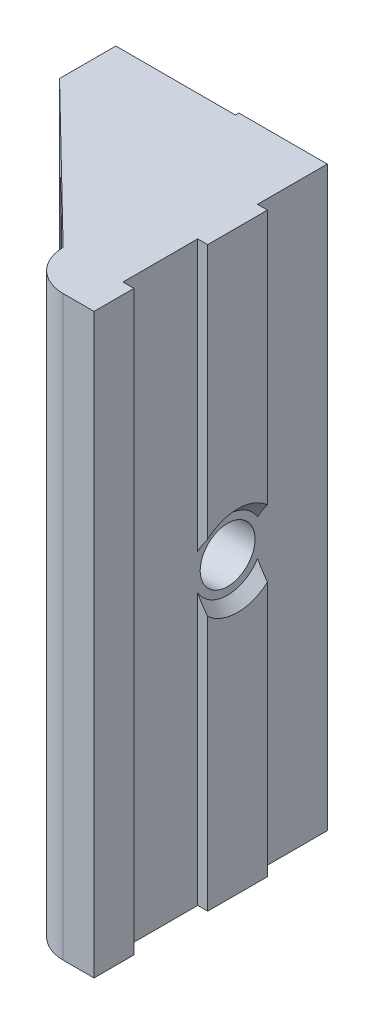
ISO-10303-21;
HEADER;
FILE_DESCRIPTION(('STEP AP214'),'2;1');
FILE_NAME('part.step','',(''),(''),'','','');
FILE_SCHEMA(('AUTOMOTIVE_DESIGN { 1 0 10303 214 1 1 1 1 }'));
ENDSEC;
DATA;
#1=APPLICATION_CONTEXT('core data for automotive mechanical design processes');
#2=APPLICATION_PROTOCOL_DEFINITION('international standard','automotive_design',2000,#1);
#3=PRODUCT_CONTEXT('',#1,'mechanical');
#4=PRODUCT('Part','Part','',(#3));
#5=PRODUCT_RELATED_PRODUCT_CATEGORY('part','',(#4));
#6=PRODUCT_DEFINITION_FORMATION('','',#4);
#7=PRODUCT_DEFINITION_CONTEXT('part definition',#1,'design');
#8=PRODUCT_DEFINITION('design','',#6,#7);
#9=PRODUCT_DEFINITION_SHAPE('','',#8);
#10=(LENGTH_UNIT() NAMED_UNIT(*) SI_UNIT(.MILLI.,.METRE.));
#11=(NAMED_UNIT(*) PLANE_ANGLE_UNIT() SI_UNIT($,.RADIAN.));
#12=(NAMED_UNIT(*) SI_UNIT($,.STERADIAN.) SOLID_ANGLE_UNIT());
#13=UNCERTAINTY_MEASURE_WITH_UNIT(LENGTH_MEASURE(1.E-05),#10,'distance_accuracy_value','');
#14=(GEOMETRIC_REPRESENTATION_CONTEXT(3) GLOBAL_UNCERTAINTY_ASSIGNED_CONTEXT((#13)) GLOBAL_UNIT_ASSIGNED_CONTEXT((#10,
#11,#12)) REPRESENTATION_CONTEXT('',''));
#15=CARTESIAN_POINT('',(0.,0.,0.));
#16=DIRECTION('',(0.,0.,1.));
#17=DIRECTION('',(1.,0.,0.));
#18=AXIS2_PLACEMENT_3D('',#15,#16,#17);
#19=CARTESIAN_POINT('',(-9.,0.,0.));
#20=DIRECTION('',(1.,0.,0.));
#21=DIRECTION('',(0.,0.,-1.));
#22=AXIS2_PLACEMENT_3D('',#19,#20,#21);
#23=PLANE('',#22);
#24=DIRECTION('',(0.,-1.,0.));
#25=VECTOR('',#24,1.);
#26=CARTESIAN_POINT('',(-9.,-28.956,13.));
#27=LINE('',#26,#25);
#28=CARTESIAN_POINT('',(-9.,28.956,13.));
#29=VERTEX_POINT('',#28);
#30=CARTESIAN_POINT('',(-9.,3.35410196624969,13.));
#31=VERTEX_POINT('',#30);
#32=EDGE_CURVE('E555',#29,#31,#27,.T.);
#33=ORIENTED_EDGE('',*,*,#32,.T.);
#34=CARTESIAN_POINT('',(-9.,0.,10.));
#35=DIRECTION('',(1.,0.,0.));
#36=DIRECTION('',(0.,0.,-1.));
#37=AXIS2_PLACEMENT_3D('',#34,#35,#36);
#38=CIRCLE('',#37,4.5);
#39=CARTESIAN_POINT('',(-9.,3.35410196624969,6.99999999999999));
#40=VERTEX_POINT('',#39);
#41=EDGE_CURVE('E524',#31,#40,#38,.F.);
#42=ORIENTED_EDGE('',*,*,#41,.T.);
#43=DIRECTION('',(0.,1.,0.));
#44=VECTOR('',#43,1.);
#45=CARTESIAN_POINT('',(-9.,-28.956,6.99999999999999));
#46=LINE('',#45,#44);
#47=CARTESIAN_POINT('',(-9.,28.956,7.));
#48=VERTEX_POINT('',#47);
#49=EDGE_CURVE('E297',#40,#48,#46,.T.);
#50=ORIENTED_EDGE('',*,*,#49,.T.);
#51=DIRECTION('',(0.,0.,1.));
#52=VECTOR('',#51,1.);
#53=CARTESIAN_POINT('',(-9.,28.956,7.));
#54=LINE('',#53,#52);
#55=EDGE_CURVE('E550',#48,#29,#54,.T.);
#56=ORIENTED_EDGE('',*,*,#55,.T.);
#57=EDGE_LOOP('',(#33,#42,#50,#56));
#58=FACE_BOUND('',#57,.T.);
#59=ADVANCED_FACE('F126',(#58),#23,.T.);
#60=CARTESIAN_POINT('',(-9.,-28.956,6.99999999999999));
#61=DIRECTION('',(0.,0.,1.));
#62=DIRECTION('',(0.,-1.,0.));
#63=AXIS2_PLACEMENT_3D('',#60,#61,#62);
#64=PLANE('',#63);
#65=DIRECTION('',(0.,1.,0.));
#66=VECTOR('',#65,1.);
#67=CARTESIAN_POINT('',(-10.,-28.956,6.99999999999999));
#68=LINE('',#67,#66);
#69=CARTESIAN_POINT('',(-10.,-28.956,6.99999999999999));
#70=VERTEX_POINT('',#69);
#71=CARTESIAN_POINT('',(-10.,-1.80277563773198,6.99999999999999));
#72=VERTEX_POINT('',#71);
#73=EDGE_CURVE('E278',#70,#72,#68,.T.);
#74=ORIENTED_EDGE('',*,*,#73,.T.);
#75=CARTESIAN_POINT('',(-10.,-1.80277563773198,6.99999999999999));
#76=CARTESIAN_POINT('',(-9.964690317231,-1.87131223911758,6.99999999999999));
#77=CARTESIAN_POINT('',(-9.92823062109702,-1.93924247382411,6.99999999999999));
#78=CARTESIAN_POINT('',(-9.85332433537536,-2.0739792796784,6.99999999999999));
#79=CARTESIAN_POINT('',(-9.81487821748002,-2.14078611263845,6.99999999999999));
#80=CARTESIAN_POINT('',(-9.69713113287627,-2.33948821505611,6.99999999999999));
#81=CARTESIAN_POINT('',(-9.61530500874234,-2.4698865397008,6.99999999999999));
#82=CARTESIAN_POINT('',(-9.44674811468295,-2.72732431182234,6.99999999999999));
#83=CARTESIAN_POINT('',(-9.36002040959327,-2.8543657868885,6.99999999999999));
#84=CARTESIAN_POINT('',(-9.22704876794235,-3.04304091049056,6.99999999999999));
#85=CARTESIAN_POINT('',(-9.18220635469892,-3.10566943304079,6.99999999999999));
#86=CARTESIAN_POINT('',(-9.0916956242936,-3.23032193951046,6.99999999999999));
#87=CARTESIAN_POINT('',(-9.0460273523368,-3.29234595623449,6.99999999999999));
#88=CARTESIAN_POINT('',(-9.,-3.35410196624968,6.99999999999999));
#89=B_SPLINE_CURVE_WITH_KNOTS('',3,(#75,#76,#77,#78,#79,#80,#81,#82,#83,#84,#85,#86,#87,#88),
.UNSPECIFIED.,.F.,.F.,(4,2,2,2,2,2,4),(0.,0.231263004816279,0.462471344460014,0.924138463174956,
1.38552003981709,1.61659573618336,1.84765882219885),.UNSPECIFIED.);
#90=CARTESIAN_POINT('',(-9.,-3.35410196624968,6.99999999999999));
#91=VERTEX_POINT('',#90);
#92=EDGE_CURVE('E155',#72,#91,#89,.T.);
#93=ORIENTED_EDGE('',*,*,#92,.T.);
#94=CARTESIAN_POINT('',(-9.,-28.956,6.99999999999999));
#95=VERTEX_POINT('',#94);
#96=EDGE_CURVE('E553',#95,#91,#46,.T.);
#97=ORIENTED_EDGE('',*,*,#96,.F.);
#98=DIRECTION('',(-1.,0.,0.));
#99=VECTOR('',#98,1.);
#100=CARTESIAN_POINT('',(-9.,-28.956,6.99999999999999));
#101=LINE('',#100,#99);
#102=EDGE_CURVE('E287',#95,#70,#101,.T.);
#103=ORIENTED_EDGE('',*,*,#102,.T.);
#104=EDGE_LOOP('',(#74,#93,#97,#103));
#105=FACE_BOUND('',#104,.T.);
#106=ADVANCED_FACE('F285',(#105),#64,.F.);
#107=CARTESIAN_POINT('',(-9.,-28.956,13.));
#108=DIRECTION('',(0.,0.,-1.));
#109=DIRECTION('',(0.,1.,0.));
#110=AXIS2_PLACEMENT_3D('',#107,#108,#109);
#111=PLANE('',#110);
#112=DIRECTION('',(0.,-1.,0.));
#113=VECTOR('',#112,1.);
#114=CARTESIAN_POINT('',(-10.,-28.956,13.));
#115=LINE('',#114,#113);
#116=CARTESIAN_POINT('',(-10.,28.956,13.));
#117=VERTEX_POINT('',#116);
#118=CARTESIAN_POINT('',(-10.,1.802775637732,13.));
#119=VERTEX_POINT('',#118);
#120=EDGE_CURVE('E290',#117,#119,#115,.T.);
#121=ORIENTED_EDGE('',*,*,#120,.T.);
#122=CARTESIAN_POINT('',(-10.,1.802775637732,13.));
#123=CARTESIAN_POINT('',(-9.964690317231,1.8713122391176,13.));
#124=CARTESIAN_POINT('',(-9.92823062109702,1.93924247382413,13.));
#125=CARTESIAN_POINT('',(-9.85332433537536,2.07397927967842,13.));
#126=CARTESIAN_POINT('',(-9.81487821748002,2.14078611263847,13.));
#127=CARTESIAN_POINT('',(-9.69713113287627,2.33948821505612,13.));
#128=CARTESIAN_POINT('',(-9.61530500874234,2.46988653970081,13.));
#129=CARTESIAN_POINT('',(-9.44674811468295,2.72732431182236,13.));
#130=CARTESIAN_POINT('',(-9.36002040959327,2.85436578688851,13.));
#131=CARTESIAN_POINT('',(-9.22704876794235,3.04304091049058,13.));
#132=CARTESIAN_POINT('',(-9.18220635469892,3.1056694330408,13.));
#133=CARTESIAN_POINT('',(-9.0916956242936,3.23032193951047,13.));
#134=CARTESIAN_POINT('',(-9.04602735233679,3.2923459562345,13.));
#135=CARTESIAN_POINT('',(-9.,3.35410196624969,13.));
#136=B_SPLINE_CURVE_WITH_KNOTS('',3,(#122,#123,#124,#125,#126,#127,#128,#129,#130,#131,#132,
#133,#134,#135),.UNSPECIFIED.,.F.,.F.,(4,2,2,2,2,2,4),(0.,0.231263004816278,0.462471344460011,
0.924138463174952,1.38552003981708,1.61659573618336,1.84765882219885),.UNSPECIFIED.);
#137=EDGE_CURVE('E435',#119,#31,#136,.T.);
#138=ORIENTED_EDGE('',*,*,#137,.T.);
#139=ORIENTED_EDGE('',*,*,#32,.F.);
#140=DIRECTION('',(-1.,0.,0.));
#141=VECTOR('',#140,1.);
#142=CARTESIAN_POINT('',(-9.,28.956,13.));
#143=LINE('',#142,#141);
#144=EDGE_CURVE('E302',#29,#117,#143,.T.);
#145=ORIENTED_EDGE('',*,*,#144,.T.);
#146=EDGE_LOOP('',(#121,#138,#139,#145));
#147=FACE_BOUND('',#146,.T.);
#148=ADVANCED_FACE('F480',(#147),#111,.F.);
#149=CARTESIAN_POINT('',(-10.,0.,6.));
#150=DIRECTION('',(-1.,0.,0.));
#151=DIRECTION('',(0.,0.,1.));
#152=AXIS2_PLACEMENT_3D('',#149,#150,#151);
#153=PLANE('',#152);
#154=CARTESIAN_POINT('',(-10.,-1.802775637732,13.));
#155=VERTEX_POINT('',#154);
#156=CARTESIAN_POINT('',(-10.,-28.956,13.));
#157=VERTEX_POINT('',#156);
#158=EDGE_CURVE('E281',#155,#157,#115,.T.);
#159=ORIENTED_EDGE('',*,*,#158,.F.);
#160=CARTESIAN_POINT('',(-10.,0.,10.));
#161=DIRECTION('',(-1.,0.,0.));
#162=DIRECTION('',(0.,0.,1.));
#163=AXIS2_PLACEMENT_3D('',#160,#161,#162);
#164=CIRCLE('',#163,3.5);
#165=EDGE_CURVE('E270',#155,#72,#164,.F.);
#166=ORIENTED_EDGE('',*,*,#165,.T.);
#167=ORIENTED_EDGE('',*,*,#73,.F.);
#168=DIRECTION('',(0.,0.,-1.));
#169=VECTOR('',#168,1.);
#170=CARTESIAN_POINT('',(-10.,-28.956,6.));
#171=LINE('',#170,#169);
#172=CARTESIAN_POINT('',(-10.,-28.956,0.));
#173=VERTEX_POINT('',#172);
#174=EDGE_CURVE('E396',#70,#173,#171,.T.);
#175=ORIENTED_EDGE('',*,*,#174,.T.);
#176=DIRECTION('',(0.,1.,0.));
#177=VECTOR('',#176,1.);
#178=CARTESIAN_POINT('',(-10.,0.,0.));
#179=LINE('',#178,#177);
#180=CARTESIAN_POINT('',(-10.,28.956,0.));
#181=VERTEX_POINT('',#180);
#182=EDGE_CURVE('E381',#173,#181,#179,.T.);
#183=ORIENTED_EDGE('',*,*,#182,.T.);
#184=DIRECTION('',(0.,0.,-1.));
#185=VECTOR('',#184,1.);
#186=CARTESIAN_POINT('',(-10.,28.956,6.));
#187=LINE('',#186,#185);
#188=CARTESIAN_POINT('',(-10.,28.956,7.));
#189=VERTEX_POINT('',#188);
#190=EDGE_CURVE('E392',#189,#181,#187,.T.);
#191=ORIENTED_EDGE('',*,*,#190,.F.);
#192=CARTESIAN_POINT('',(-10.,1.80277563773199,6.99999999999999));
#193=VERTEX_POINT('',#192);
#194=EDGE_CURVE('E288',#193,#189,#68,.T.);
#195=ORIENTED_EDGE('',*,*,#194,.F.);
#196=EDGE_CURVE('E283',#193,#119,#164,.F.);
#197=ORIENTED_EDGE('',*,*,#196,.T.);
#198=ORIENTED_EDGE('',*,*,#120,.F.);
#199=CARTESIAN_POINT('',(-10.,28.956,20.5));
#200=VERTEX_POINT('',#199);
#201=EDGE_CURVE('E393',#200,#117,#187,.T.);
#202=ORIENTED_EDGE('',*,*,#201,.F.);
#203=DIRECTION('',(0.,-1.,0.));
#204=VECTOR('',#203,1.);
#205=CARTESIAN_POINT('',(-10.,57.6707265527638,20.5));
#206=LINE('',#205,#204);
#207=CARTESIAN_POINT('',(-10.,-28.956,20.5));
#208=VERTEX_POINT('',#207);
#209=EDGE_CURVE('E365',#200,#208,#206,.T.);
#210=ORIENTED_EDGE('',*,*,#209,.T.);
#211=EDGE_CURVE('E397',#208,#157,#171,.T.);
#212=ORIENTED_EDGE('',*,*,#211,.T.);
#213=EDGE_LOOP('',(#159,#166,#167,#175,#183,#191,#195,#197,#198,#202,#210,#212));
#214=FACE_BOUND('',#213,.T.);
#215=CARTESIAN_POINT('',(-10.,0.,10.));
#216=DIRECTION('',(-1.,0.,0.));
#217=DIRECTION('',(0.,0.,1.));
#218=AXIS2_PLACEMENT_3D('',#215,#216,#217);
#219=CIRCLE('',#218,2.75);
#220=CARTESIAN_POINT('',(-10.,0.,12.75));
#221=VERTEX_POINT('',#220);
#222=EDGE_CURVE('E282',#221,#221,#219,.F.);
#223=ORIENTED_EDGE('',*,*,#222,.F.);
#224=EDGE_LOOP('',(#223));
#225=FACE_BOUND('',#224,.T.);
#226=ADVANCED_FACE('F276',(#214,#225),#153,.F.);
#227=CARTESIAN_POINT('',(0.,0.,0.));
#228=DIRECTION('',(0.,0.,1.));
#229=DIRECTION('',(1.,0.,0.));
#230=AXIS2_PLACEMENT_3D('',#227,#228,#229);
#231=PLANE('',#230);
#232=DIRECTION('',(-1.,0.,0.));
#233=VECTOR('',#232,1.);
#234=CARTESIAN_POINT('',(0.,-28.956,0.));
#235=LINE('',#234,#233);
#236=CARTESIAN_POINT('',(-18.861,-28.956,0.));
#237=VERTEX_POINT('',#236);
#238=EDGE_CURVE('E351',#173,#237,#235,.T.);
#239=ORIENTED_EDGE('',*,*,#238,.T.);
#240=DIRECTION('',(0.,1.,0.));
#241=VECTOR('',#240,1.);
#242=CARTESIAN_POINT('',(-18.861,-28.956,0.));
#243=LINE('',#242,#241);
#244=CARTESIAN_POINT('',(-18.861,28.956,0.));
#245=VERTEX_POINT('',#244);
#246=EDGE_CURVE('E320',#237,#245,#243,.T.);
#247=ORIENTED_EDGE('',*,*,#246,.T.);
#248=DIRECTION('',(-1.,0.,0.));
#249=VECTOR('',#248,1.);
#250=CARTESIAN_POINT('',(0.,28.956,0.));
#251=LINE('',#250,#249);
#252=EDGE_CURVE('E384',#181,#245,#251,.T.);
#253=ORIENTED_EDGE('',*,*,#252,.F.);
#254=ORIENTED_EDGE('',*,*,#182,.F.);
#255=EDGE_LOOP('',(#239,#247,#253,#254));
#256=FACE_BOUND('',#255,.T.);
#257=ADVANCED_FACE('F466',(#256),#231,.F.);
#258=CARTESIAN_POINT('',(0.,28.956,6.));
#259=DIRECTION('',(0.,-1.,0.));
#260=DIRECTION('',(1.,0.,0.));
#261=AXIS2_PLACEMENT_3D('',#258,#259,#260);
#262=PLANE('',#261);
#263=DIRECTION('',(0.71574671716627,0.,0.698359962244191));
#264=VECTOR('',#263,1.);
#265=CARTESIAN_POINT('',(-30.861,28.956,6.00000000000001));
#266=LINE('',#265,#264);
#267=CARTESIAN_POINT('',(-30.861,28.956,6.));
#268=VERTEX_POINT('',#267);
#269=CARTESIAN_POINT('',(-16.,28.956,20.5));
#270=VERTEX_POINT('',#269);
#271=EDGE_CURVE('E349',#268,#270,#266,.T.);
#272=ORIENTED_EDGE('',*,*,#271,.T.);
#273=CARTESIAN_POINT('',(-12.,28.956,20.5));
#274=DIRECTION('',(0.,-1.,0.));
#275=DIRECTION('',(1.,0.,0.));
#276=AXIS2_PLACEMENT_3D('',#273,#274,#275);
#277=CIRCLE('',#276,4.);
#278=CARTESIAN_POINT('',(-12.,28.956,24.5));
#279=VERTEX_POINT('',#278);
#280=EDGE_CURVE('E422',#270,#279,#277,.F.);
#281=ORIENTED_EDGE('',*,*,#280,.T.);
#282=DIRECTION('',(1.,0.,0.));
#283=VECTOR('',#282,1.);
#284=CARTESIAN_POINT('',(-16.,28.956,24.5));
#285=LINE('',#284,#283);
#286=CARTESIAN_POINT('',(-8.9,28.956,24.5));
#287=VERTEX_POINT('',#286);
#288=EDGE_CURVE('E347',#279,#287,#285,.T.);
#289=ORIENTED_EDGE('',*,*,#288,.T.);
#290=DIRECTION('',(0.,0.,-1.));
#291=VECTOR('',#290,1.);
#292=CARTESIAN_POINT('',(-8.9,28.956,20.5));
#293=LINE('',#292,#291);
#294=CARTESIAN_POINT('',(-8.9,28.956,20.5));
#295=VERTEX_POINT('',#294);
#296=EDGE_CURVE('E344',#287,#295,#293,.T.);
#297=ORIENTED_EDGE('',*,*,#296,.T.);
#298=DIRECTION('',(-1.,0.,0.));
#299=VECTOR('',#298,1.);
#300=CARTESIAN_POINT('',(-9.99999999999999,28.956,20.5));
#301=LINE('',#300,#299);
#302=EDGE_CURVE('E341',#295,#200,#301,.T.);
#303=ORIENTED_EDGE('',*,*,#302,.T.);
#304=ORIENTED_EDGE('',*,*,#201,.T.);
#305=ORIENTED_EDGE('',*,*,#144,.F.);
#306=ORIENTED_EDGE('',*,*,#55,.F.);
#307=DIRECTION('',(-1.,0.,0.));
#308=VECTOR('',#307,1.);
#309=CARTESIAN_POINT('',(-9.,28.956,7.));
#310=LINE('',#309,#308);
#311=EDGE_CURVE('E305',#48,#189,#310,.T.);
#312=ORIENTED_EDGE('',*,*,#311,.T.);
#313=ORIENTED_EDGE('',*,*,#190,.T.);
#314=ORIENTED_EDGE('',*,*,#252,.T.);
#315=DIRECTION('',(0.,0.,-1.));
#316=VECTOR('',#315,1.);
#317=CARTESIAN_POINT('',(-18.861,28.956,0.));
#318=LINE('',#317,#316);
#319=CARTESIAN_POINT('',(-18.861,28.956,0.35));
#320=VERTEX_POINT('',#319);
#321=EDGE_CURVE('E313',#320,#245,#318,.T.);
#322=ORIENTED_EDGE('',*,*,#321,.F.);
#323=DIRECTION('',(1.,0.,0.));
#324=VECTOR('',#323,1.);
#325=CARTESIAN_POINT('',(-30.861,28.956,0.35));
#326=LINE('',#325,#324);
#327=CARTESIAN_POINT('',(-30.861,28.956,0.35));
#328=VERTEX_POINT('',#327);
#329=EDGE_CURVE('E308',#328,#320,#326,.T.);
#330=ORIENTED_EDGE('',*,*,#329,.F.);
#331=DIRECTION('',(0.,0.,-1.));
#332=VECTOR('',#331,1.);
#333=CARTESIAN_POINT('',(-30.861,28.956,6.));
#334=LINE('',#333,#332);
#335=EDGE_CURVE('E389',#268,#328,#334,.T.);
#336=ORIENTED_EDGE('',*,*,#335,.F.);
#337=EDGE_LOOP('',(#272,#281,#289,#297,#303,#304,#305,#306,#312,#313,#314,#322,#330,#336));
#338=FACE_BOUND('',#337,.T.);
#339=ADVANCED_FACE('F469',(#338),#262,.F.);
#340=CARTESIAN_POINT('',(-30.861,0.,6.));
#341=DIRECTION('',(1.,0.,0.));
#342=DIRECTION('',(0.,0.,-1.));
#343=AXIS2_PLACEMENT_3D('',#340,#341,#342);
#344=PLANE('',#343);
#345=ORIENTED_EDGE('',*,*,#335,.T.);
#346=DIRECTION('',(0.,1.,0.));
#347=VECTOR('',#346,1.);
#348=CARTESIAN_POINT('',(-30.861,-28.956,0.35));
#349=LINE('',#348,#347);
#350=CARTESIAN_POINT('',(-30.861,-28.956,0.35));
#351=VERTEX_POINT('',#350);
#352=EDGE_CURVE('E316',#351,#328,#349,.T.);
#353=ORIENTED_EDGE('',*,*,#352,.F.);
#354=DIRECTION('',(0.,0.,-1.));
#355=VECTOR('',#354,1.);
#356=CARTESIAN_POINT('',(-30.861,-28.956,6.));
#357=LINE('',#356,#355);
#358=CARTESIAN_POINT('',(-30.861,-28.956,6.));
#359=VERTEX_POINT('',#358);
#360=EDGE_CURVE('E377',#359,#351,#357,.T.);
#361=ORIENTED_EDGE('',*,*,#360,.F.);
#362=DIRECTION('',(0.,-1.,0.));
#363=VECTOR('',#362,1.);
#364=CARTESIAN_POINT('',(-30.861,0.,6.));
#365=LINE('',#364,#363);
#366=CARTESIAN_POINT('',(-30.861,-3.40036762718386,6.));
#367=VERTEX_POINT('',#366);
#368=EDGE_CURVE('E378',#367,#359,#365,.T.);
#369=ORIENTED_EDGE('',*,*,#368,.F.);
#370=CARTESIAN_POINT('',(-30.861,0.,10.));
#371=DIRECTION('',(1.,0.,0.));
#372=DIRECTION('',(0.,0.,-1.));
#373=AXIS2_PLACEMENT_3D('',#370,#371,#372);
#374=CIRCLE('',#373,5.25);
#375=CARTESIAN_POINT('',(-30.861,3.40036762718386,6.));
#376=VERTEX_POINT('',#375);
#377=EDGE_CURVE('E330',#367,#376,#374,.T.);
#378=ORIENTED_EDGE('',*,*,#377,.T.);
#379=EDGE_CURVE('E374',#268,#376,#365,.T.);
#380=ORIENTED_EDGE('',*,*,#379,.F.);
#381=EDGE_LOOP('',(#345,#353,#361,#369,#378,#380));
#382=FACE_BOUND('',#381,.T.);
#383=ADVANCED_FACE('F471',(#382),#344,.F.);
#384=CARTESIAN_POINT('',(0.,-28.956,6.));
#385=DIRECTION('',(0.,-1.,0.));
#386=DIRECTION('',(0.,0.,-1.));
#387=AXIS2_PLACEMENT_3D('',#384,#385,#386);
#388=PLANE('',#387);
#389=DIRECTION('',(-1.,0.,0.));
#390=VECTOR('',#389,1.);
#391=CARTESIAN_POINT('',(-16.,-28.956,24.5));
#392=LINE('',#391,#390);
#393=CARTESIAN_POINT('',(-8.9,-28.956,24.5));
#394=VERTEX_POINT('',#393);
#395=CARTESIAN_POINT('',(-12.,-28.956,24.5));
#396=VERTEX_POINT('',#395);
#397=EDGE_CURVE('E359',#394,#396,#392,.T.);
#398=ORIENTED_EDGE('',*,*,#397,.T.);
#399=CARTESIAN_POINT('',(-12.,-28.956,20.5));
#400=DIRECTION('',(0.,-1.,0.));
#401=DIRECTION('',(0.,0.,-1.));
#402=AXIS2_PLACEMENT_3D('',#399,#400,#401);
#403=CIRCLE('',#402,4.);
#404=CARTESIAN_POINT('',(-16.,-28.956,20.5));
#405=VERTEX_POINT('',#404);
#406=EDGE_CURVE('E420',#396,#405,#403,.T.);
#407=ORIENTED_EDGE('',*,*,#406,.T.);
#408=DIRECTION('',(-0.71574671716627,0.,-0.698359962244191));
#409=VECTOR('',#408,1.);
#410=CARTESIAN_POINT('',(-30.861,-28.956,6.));
#411=LINE('',#410,#409);
#412=EDGE_CURVE('E362',#405,#359,#411,.T.);
#413=ORIENTED_EDGE('',*,*,#412,.T.);
#414=ORIENTED_EDGE('',*,*,#360,.T.);
#415=DIRECTION('',(1.,0.,0.));
#416=VECTOR('',#415,1.);
#417=CARTESIAN_POINT('',(-30.861,-28.956,0.35));
#418=LINE('',#417,#416);
#419=CARTESIAN_POINT('',(-18.861,-28.956,0.35));
#420=VERTEX_POINT('',#419);
#421=EDGE_CURVE('E309',#351,#420,#418,.T.);
#422=ORIENTED_EDGE('',*,*,#421,.T.);
#423=DIRECTION('',(0.,0.,-1.));
#424=VECTOR('',#423,1.);
#425=CARTESIAN_POINT('',(-18.861,-28.956,0.));
#426=LINE('',#425,#424);
#427=EDGE_CURVE('E312',#420,#237,#426,.T.);
#428=ORIENTED_EDGE('',*,*,#427,.T.);
#429=ORIENTED_EDGE('',*,*,#238,.F.);
#430=ORIENTED_EDGE('',*,*,#174,.F.);
#431=ORIENTED_EDGE('',*,*,#102,.F.);
#432=DIRECTION('',(0.,0.,-1.));
#433=VECTOR('',#432,1.);
#434=CARTESIAN_POINT('',(-9.,-28.956,6.99999999999999));
#435=LINE('',#434,#433);
#436=CARTESIAN_POINT('',(-9.,-28.956,13.));
#437=VERTEX_POINT('',#436);
#438=EDGE_CURVE('E293',#437,#95,#435,.T.);
#439=ORIENTED_EDGE('',*,*,#438,.F.);
#440=DIRECTION('',(-1.,0.,0.));
#441=VECTOR('',#440,1.);
#442=CARTESIAN_POINT('',(-9.,-28.956,13.));
#443=LINE('',#442,#441);
#444=EDGE_CURVE('E299',#437,#157,#443,.T.);
#445=ORIENTED_EDGE('',*,*,#444,.T.);
#446=ORIENTED_EDGE('',*,*,#211,.F.);
#447=DIRECTION('',(1.,0.,0.));
#448=VECTOR('',#447,1.);
#449=CARTESIAN_POINT('',(-10.,-28.956,20.5));
#450=LINE('',#449,#448);
#451=CARTESIAN_POINT('',(-8.9,-28.956,20.5));
#452=VERTEX_POINT('',#451);
#453=EDGE_CURVE('E352',#208,#452,#450,.T.);
#454=ORIENTED_EDGE('',*,*,#453,.T.);
#455=DIRECTION('',(0.,0.,1.));
#456=VECTOR('',#455,1.);
#457=CARTESIAN_POINT('',(-8.9,-28.956,20.5));
#458=LINE('',#457,#456);
#459=EDGE_CURVE('E355',#452,#394,#458,.T.);
#460=ORIENTED_EDGE('',*,*,#459,.T.);
#461=EDGE_LOOP('',(#398,#407,#413,#414,#422,#428,#429,#430,#431,#439,#445,#446,#454,#460));
#462=FACE_BOUND('',#461,.T.);
#463=ADVANCED_FACE('F451',(#462),#388,.T.);
#464=CARTESIAN_POINT('',(-30.861,57.6707265527638,6.));
#465=DIRECTION('',(-0.698359962244191,0.,0.71574671716627));
#466=DIRECTION('',(0.71574671716627,0.,0.698359962244191));
#467=AXIS2_PLACEMENT_3D('',#464,#465,#466);
#468=PLANE('',#467);
#469=CARTESIAN_POINT('',(-26.7614137931034,0.,10.));
#470=DIRECTION('',(-0.698359962244191,0.,0.71574671716627));
#471=DIRECTION('',(0.71574671716627,0.,0.698359962244191));
#472=AXIS2_PLACEMENT_3D('',#469,#470,#471);
#473=ELLIPSE('',#472,7.51761309902281,5.25);
#474=CARTESIAN_POINT('',(-21.5,-1.09936454457695,15.1336047372316));
#475=VERTEX_POINT('',#474);
#476=EDGE_CURVE('E412',#367,#475,#473,.T.);
#477=ORIENTED_EDGE('',*,*,#476,.F.);
#478=ORIENTED_EDGE('',*,*,#368,.T.);
#479=ORIENTED_EDGE('',*,*,#412,.F.);
#480=DIRECTION('',(0.,-1.,0.));
#481=VECTOR('',#480,1.);
#482=CARTESIAN_POINT('',(-16.,57.6707265527638,20.5));
#483=LINE('',#482,#481);
#484=EDGE_CURVE('E345',#270,#405,#483,.T.);
#485=ORIENTED_EDGE('',*,*,#484,.F.);
#486=ORIENTED_EDGE('',*,*,#271,.F.);
#487=ORIENTED_EDGE('',*,*,#379,.T.);
#488=CARTESIAN_POINT('',(-21.5,1.09936454457695,15.1336047372316));
#489=VERTEX_POINT('',#488);
#490=EDGE_CURVE('E399',#489,#376,#473,.T.);
#491=ORIENTED_EDGE('',*,*,#490,.F.);
#492=CARTESIAN_POINT('',(-21.5,1.09936454457695,15.1336047372316));
#493=CARTESIAN_POINT('',(-21.4607245438961,0.732909696384636,15.1719261229733));
#494=CARTESIAN_POINT('',(-21.4410868158442,0.366454848192318,15.1910868158441));
#495=CARTESIAN_POINT('',(-21.4410868158442,-0.366454848192318,15.1910868158441));
#496=CARTESIAN_POINT('',(-21.4607245438961,-0.732909696384636,15.1719261229733));
#497=CARTESIAN_POINT('',(-21.5,-1.09936454457695,15.1336047372316));
#498=B_SPLINE_CURVE_WITH_KNOTS('',3,(#492,#493,#494,#495,#496,#497),.UNSPECIFIED.,.F.,.F.,(4,2,
4),(0.,1.102441542442,2.20488308488399),.UNSPECIFIED.);
#499=EDGE_CURVE('E427',#489,#475,#498,.T.);
#500=ORIENTED_EDGE('',*,*,#499,.T.);
#501=EDGE_LOOP('',(#477,#478,#479,#485,#486,#487,#491,#500));
#502=FACE_BOUND('',#501,.T.);
#503=CARTESIAN_POINT('',(-24.8158,-19.05,11.8983513895431));
#504=DIRECTION('',(-0.698359962244191,0.,0.71574671716627));
#505=DIRECTION('',(-0.71574671716627,0.,-0.698359962244191));
#506=AXIS2_PLACEMENT_3D('',#503,#504,#505);
#507=ELLIPSE('',#506,7.33499696762201,5.25);
#508=CARTESIAN_POINT('',(-30.0658,-19.05,6.77588318417334));
#509=VERTEX_POINT('',#508);
#510=EDGE_CURVE('E356',#509,#509,#507,.T.);
#511=ORIENTED_EDGE('',*,*,#510,.F.);
#512=EDGE_LOOP('',(#511));
#513=FACE_BOUND('',#512,.T.);
#514=CARTESIAN_POINT('',(-24.8158,19.05,11.8983513895431));
#515=DIRECTION('',(-0.698359962244191,0.,0.71574671716627));
#516=DIRECTION('',(-0.71574671716627,0.,-0.698359962244191));
#517=AXIS2_PLACEMENT_3D('',#514,#515,#516);
#518=ELLIPSE('',#517,7.33499696762201,5.25);
#519=CARTESIAN_POINT('',(-30.0658,19.05,6.77588318417334));
#520=VERTEX_POINT('',#519);
#521=EDGE_CURVE('E405',#520,#520,#518,.T.);
#522=ORIENTED_EDGE('',*,*,#521,.F.);
#523=EDGE_LOOP('',(#522));
#524=FACE_BOUND('',#523,.T.);
#525=ADVANCED_FACE('F445',(#502,#513,#524),#468,.T.);
#526=CARTESIAN_POINT('',(-16.,57.6707265527638,24.5));
#527=DIRECTION('',(0.,0.,1.));
#528=DIRECTION('',(1.,0.,0.));
#529=AXIS2_PLACEMENT_3D('',#526,#527,#528);
#530=PLANE('',#529);
#531=ORIENTED_EDGE('',*,*,#288,.F.);
#532=DIRECTION('',(0.,-1.,0.));
#533=VECTOR('',#532,1.);
#534=CARTESIAN_POINT('',(-12.,57.6707265527638,24.5));
#535=LINE('',#534,#533);
#536=EDGE_CURVE('E415',#279,#396,#535,.T.);
#537=ORIENTED_EDGE('',*,*,#536,.T.);
#538=ORIENTED_EDGE('',*,*,#397,.F.);
#539=DIRECTION('',(0.,-1.,0.));
#540=VECTOR('',#539,1.);
#541=CARTESIAN_POINT('',(-8.9,57.6707265527638,24.5));
#542=LINE('',#541,#540);
#543=EDGE_CURVE('E368',#287,#394,#542,.T.);
#544=ORIENTED_EDGE('',*,*,#543,.F.);
#545=EDGE_LOOP('',(#531,#537,#538,#544));
#546=FACE_BOUND('',#545,.T.);
#547=ADVANCED_FACE('F450',(#546),#530,.T.);
#548=CARTESIAN_POINT('',(-8.9,57.6707265527638,20.5));
#549=DIRECTION('',(1.,0.,0.));
#550=DIRECTION('',(0.,0.,-1.));
#551=AXIS2_PLACEMENT_3D('',#548,#549,#550);
#552=PLANE('',#551);
#553=ORIENTED_EDGE('',*,*,#296,.F.);
#554=ORIENTED_EDGE('',*,*,#543,.T.);
#555=ORIENTED_EDGE('',*,*,#459,.F.);
#556=DIRECTION('',(0.,-1.,0.));
#557=VECTOR('',#556,1.);
#558=CARTESIAN_POINT('',(-8.9,57.6707265527638,20.5));
#559=LINE('',#558,#557);
#560=EDGE_CURVE('E370',#295,#452,#559,.T.);
#561=ORIENTED_EDGE('',*,*,#560,.F.);
#562=EDGE_LOOP('',(#553,#554,#555,#561));
#563=FACE_BOUND('',#562,.T.);
#564=ADVANCED_FACE('F457',(#563),#552,.T.);
#565=CARTESIAN_POINT('',(-10.,57.6707265527638,20.5));
#566=DIRECTION('',(0.,0.,-1.));
#567=DIRECTION('',(-1.,0.,0.));
#568=AXIS2_PLACEMENT_3D('',#565,#566,#567);
#569=PLANE('',#568);
#570=ORIENTED_EDGE('',*,*,#302,.F.);
#571=ORIENTED_EDGE('',*,*,#560,.T.);
#572=ORIENTED_EDGE('',*,*,#453,.F.);
#573=ORIENTED_EDGE('',*,*,#209,.F.);
#574=EDGE_LOOP('',(#570,#571,#572,#573));
#575=FACE_BOUND('',#574,.T.);
#576=ADVANCED_FACE('F461',(#575),#569,.T.);
#577=CARTESIAN_POINT('',(-24.8158,19.05,24.5));
#578=DIRECTION('',(0.,0.,-1.));
#579=DIRECTION('',(-1.,0.,0.));
#580=AXIS2_PLACEMENT_3D('',#577,#578,#579);
#581=CYLINDRICAL_SURFACE('',#580,3.25);
#582=CARTESIAN_POINT('',(-24.8158,19.05,0.35));
#583=DIRECTION('',(0.,0.,1.));
#584=DIRECTION('',(1.,0.,0.));
#585=AXIS2_PLACEMENT_3D('',#582,#583,#584);
#586=CIRCLE('',#585,3.25);
#587=CARTESIAN_POINT('',(-21.5658,19.05,0.35));
#588=VERTEX_POINT('',#587);
#589=EDGE_CURVE('E327',#588,#588,#586,.F.);
#590=ORIENTED_EDGE('',*,*,#589,.T.);
#591=EDGE_LOOP('',(#590));
#592=FACE_BOUND('',#591,.T.);
#593=CARTESIAN_POINT('',(-24.8158,19.05,6.));
#594=DIRECTION('',(0.,0.,-1.));
#595=DIRECTION('',(-1.,0.,0.));
#596=AXIS2_PLACEMENT_3D('',#593,#594,#595);
#597=CIRCLE('',#596,3.25);
#598=CARTESIAN_POINT('',(-28.0658,19.05,6.));
#599=VERTEX_POINT('',#598);
#600=EDGE_CURVE('E402',#599,#599,#597,.F.);
#601=ORIENTED_EDGE('',*,*,#600,.T.);
#602=EDGE_LOOP('',(#601));
#603=FACE_BOUND('',#602,.T.);
#604=ADVANCED_FACE('F453',(#592,#603),#581,.F.);
#605=CARTESIAN_POINT('',(-24.8158,-19.05,24.5));
#606=DIRECTION('',(0.,0.,-1.));
#607=DIRECTION('',(-1.,0.,0.));
#608=AXIS2_PLACEMENT_3D('',#605,#606,#607);
#609=CYLINDRICAL_SURFACE('',#608,3.25);
#610=CARTESIAN_POINT('',(-24.8158,-19.05,0.35));
#611=DIRECTION('',(0.,0.,1.));
#612=DIRECTION('',(1.,0.,0.));
#613=AXIS2_PLACEMENT_3D('',#610,#611,#612);
#614=CIRCLE('',#613,3.25);
#615=CARTESIAN_POINT('',(-21.5658,-19.05,0.35));
#616=VERTEX_POINT('',#615);
#617=EDGE_CURVE('E323',#616,#616,#614,.F.);
#618=ORIENTED_EDGE('',*,*,#617,.T.);
#619=EDGE_LOOP('',(#618));
#620=FACE_BOUND('',#619,.T.);
#621=CARTESIAN_POINT('',(-24.8158,-19.05,6.));
#622=DIRECTION('',(0.,0.,-1.));
#623=DIRECTION('',(-1.,0.,0.));
#624=AXIS2_PLACEMENT_3D('',#621,#622,#623);
#625=CIRCLE('',#624,3.25);
#626=CARTESIAN_POINT('',(-28.0658,-19.05,6.));
#627=VERTEX_POINT('',#626);
#628=EDGE_CURVE('E337',#627,#627,#625,.F.);
#629=ORIENTED_EDGE('',*,*,#628,.T.);
#630=EDGE_LOOP('',(#629));
#631=FACE_BOUND('',#630,.T.);
#632=ADVANCED_FACE('F638',(#620,#631),#609,.F.);
#633=CARTESIAN_POINT('',(-24.8158,-19.05,6.));
#634=DIRECTION('',(0.,0.,-1.));
#635=DIRECTION('',(-1.,0.,0.));
#636=AXIS2_PLACEMENT_3D('',#633,#634,#635);
#637=PLANE('',#636);
#638=CARTESIAN_POINT('',(-24.8158,-19.05,6.));
#639=DIRECTION('',(0.,0.,-1.));
#640=DIRECTION('',(-1.,0.,0.));
#641=AXIS2_PLACEMENT_3D('',#638,#639,#640);
#642=CIRCLE('',#641,5.25);
#643=CARTESIAN_POINT('',(-30.0658,-19.05,6.));
#644=VERTEX_POINT('',#643);
#645=EDGE_CURVE('E334',#644,#644,#642,.T.);
#646=ORIENTED_EDGE('',*,*,#645,.F.);
#647=EDGE_LOOP('',(#646));
#648=FACE_BOUND('',#647,.T.);
#649=ORIENTED_EDGE('',*,*,#628,.F.);
#650=EDGE_LOOP('',(#649));
#651=FACE_BOUND('',#650,.T.);
#652=ADVANCED_FACE('F645',(#648,#651),#637,.F.);
#653=CARTESIAN_POINT('',(-24.8158,-19.05,24.5));
#654=DIRECTION('',(0.,0.,-1.));
#655=DIRECTION('',(-1.,0.,0.));
#656=AXIS2_PLACEMENT_3D('',#653,#654,#655);
#657=CYLINDRICAL_SURFACE('',#656,5.25);
#658=ORIENTED_EDGE('',*,*,#510,.T.);
#659=EDGE_LOOP('',(#658));
#660=FACE_BOUND('',#659,.T.);
#661=ORIENTED_EDGE('',*,*,#645,.T.);
#662=EDGE_LOOP('',(#661));
#663=FACE_BOUND('',#662,.T.);
#664=ADVANCED_FACE('F652',(#660,#663),#657,.F.);
#665=CARTESIAN_POINT('',(-24.8158,19.05,6.));
#666=DIRECTION('',(0.,0.,-1.));
#667=DIRECTION('',(-1.,0.,0.));
#668=AXIS2_PLACEMENT_3D('',#665,#666,#667);
#669=PLANE('',#668);
#670=CARTESIAN_POINT('',(-24.8158,19.05,6.));
#671=DIRECTION('',(0.,0.,-1.));
#672=DIRECTION('',(-1.,0.,0.));
#673=AXIS2_PLACEMENT_3D('',#670,#671,#672);
#674=CIRCLE('',#673,5.25);
#675=CARTESIAN_POINT('',(-30.0658,19.05,6.));
#676=VERTEX_POINT('',#675);
#677=EDGE_CURVE('E338',#676,#676,#674,.T.);
#678=ORIENTED_EDGE('',*,*,#677,.F.);
#679=EDGE_LOOP('',(#678));
#680=FACE_BOUND('',#679,.T.);
#681=ORIENTED_EDGE('',*,*,#600,.F.);
#682=EDGE_LOOP('',(#681));
#683=FACE_BOUND('',#682,.T.);
#684=ADVANCED_FACE('F660',(#680,#683),#669,.F.);
#685=CARTESIAN_POINT('',(-24.8158,19.05,24.5));
#686=DIRECTION('',(0.,0.,-1.));
#687=DIRECTION('',(-1.,0.,0.));
#688=AXIS2_PLACEMENT_3D('',#685,#686,#687);
#689=CYLINDRICAL_SURFACE('',#688,5.25);
#690=ORIENTED_EDGE('',*,*,#521,.T.);
#691=EDGE_LOOP('',(#690));
#692=FACE_BOUND('',#691,.T.);
#693=ORIENTED_EDGE('',*,*,#677,.T.);
#694=EDGE_LOOP('',(#693));
#695=FACE_BOUND('',#694,.T.);
#696=ADVANCED_FACE('F668',(#692,#695),#689,.F.);
#697=CARTESIAN_POINT('',(-30.861,0.,10.));
#698=DIRECTION('',(1.,0.,0.));
#699=DIRECTION('',(0.,0.,-1.));
#700=AXIS2_PLACEMENT_3D('',#697,#698,#699);
#701=CYLINDRICAL_SURFACE('',#700,2.75);
#702=ORIENTED_EDGE('',*,*,#222,.T.);
#703=EDGE_LOOP('',(#702));
#704=FACE_BOUND('',#703,.T.);
#705=CARTESIAN_POINT('',(-19.,0.,10.));
#706=DIRECTION('',(1.,0.,0.));
#707=DIRECTION('',(0.,0.,-1.));
#708=AXIS2_PLACEMENT_3D('',#705,#706,#707);
#709=CIRCLE('',#708,2.75);
#710=CARTESIAN_POINT('',(-19.,0.,7.25));
#711=VERTEX_POINT('',#710);
#712=EDGE_CURVE('E333',#711,#711,#709,.F.);
#713=ORIENTED_EDGE('',*,*,#712,.T.);
#714=EDGE_LOOP('',(#713));
#715=FACE_BOUND('',#714,.T.);
#716=ADVANCED_FACE('F675',(#704,#715),#701,.F.);
#717=CARTESIAN_POINT('',(-30.861,0.,10.));
#718=DIRECTION('',(1.,0.,0.));
#719=DIRECTION('',(0.,0.,-1.));
#720=AXIS2_PLACEMENT_3D('',#717,#718,#719);
#721=CYLINDRICAL_SURFACE('',#720,5.25);
#722=ORIENTED_EDGE('',*,*,#476,.T.);
#723=CARTESIAN_POINT('',(-21.5,0.,10.));
#724=DIRECTION('',(1.,0.,0.));
#725=DIRECTION('',(0.,0.,-1.));
#726=AXIS2_PLACEMENT_3D('',#723,#724,#725);
#727=CIRCLE('',#726,5.25);
#728=EDGE_CURVE('E424',#475,#489,#727,.T.);
#729=ORIENTED_EDGE('',*,*,#728,.T.);
#730=ORIENTED_EDGE('',*,*,#490,.T.);
#731=ORIENTED_EDGE('',*,*,#377,.F.);
#732=EDGE_LOOP('',(#722,#729,#730,#731));
#733=FACE_BOUND('',#732,.T.);
#734=ADVANCED_FACE('F683',(#733),#721,.F.);
#735=CARTESIAN_POINT('',(-30.861,-28.956,0.35));
#736=DIRECTION('',(0.,0.,1.));
#737=DIRECTION('',(1.,0.,0.));
#738=AXIS2_PLACEMENT_3D('',#735,#736,#737);
#739=PLANE('',#738);
#740=ORIENTED_EDGE('',*,*,#617,.F.);
#741=EDGE_LOOP('',(#740));
#742=FACE_BOUND('',#741,.T.);
#743=ORIENTED_EDGE('',*,*,#329,.T.);
#744=DIRECTION('',(0.,1.,0.));
#745=VECTOR('',#744,1.);
#746=CARTESIAN_POINT('',(-18.861,-28.956,0.35));
#747=LINE('',#746,#745);
#748=EDGE_CURVE('E324',#420,#320,#747,.T.);
#749=ORIENTED_EDGE('',*,*,#748,.F.);
#750=ORIENTED_EDGE('',*,*,#421,.F.);
#751=ORIENTED_EDGE('',*,*,#352,.T.);
#752=EDGE_LOOP('',(#743,#749,#750,#751));
#753=FACE_BOUND('',#752,.T.);
#754=ORIENTED_EDGE('',*,*,#589,.F.);
#755=EDGE_LOOP('',(#754));
#756=FACE_BOUND('',#755,.T.);
#757=ADVANCED_FACE('F494',(#742,#753,#756),#739,.F.);
#758=CARTESIAN_POINT('',(-18.861,-28.956,0.));
#759=DIRECTION('',(1.,0.,0.));
#760=DIRECTION('',(0.,1.,0.));
#761=AXIS2_PLACEMENT_3D('',#758,#759,#760);
#762=PLANE('',#761);
#763=ORIENTED_EDGE('',*,*,#321,.T.);
#764=ORIENTED_EDGE('',*,*,#246,.F.);
#765=ORIENTED_EDGE('',*,*,#427,.F.);
#766=ORIENTED_EDGE('',*,*,#748,.T.);
#767=EDGE_LOOP('',(#763,#764,#765,#766));
#768=FACE_BOUND('',#767,.T.);
#769=ADVANCED_FACE('F486',(#768),#762,.F.);
#770=CARTESIAN_POINT('',(-12.,57.6707265527638,20.5));
#771=DIRECTION('',(0.,-1.,0.));
#772=DIRECTION('',(0.,0.,-1.));
#773=AXIS2_PLACEMENT_3D('',#770,#771,#772);
#774=CYLINDRICAL_SURFACE('',#773,4.);
#775=ORIENTED_EDGE('',*,*,#280,.F.);
#776=ORIENTED_EDGE('',*,*,#484,.T.);
#777=ORIENTED_EDGE('',*,*,#406,.F.);
#778=ORIENTED_EDGE('',*,*,#536,.F.);
#779=EDGE_LOOP('',(#775,#776,#777,#778));
#780=FACE_BOUND('',#779,.T.);
#781=ADVANCED_FACE('F483',(#780),#774,.T.);
#782=ORIENTED_EDGE('',*,*,#96,.T.);
#783=CARTESIAN_POINT('',(-9.,0.,10.));
#784=DIRECTION('',(1.,0.,0.));
#785=DIRECTION('',(0.,0.,-1.));
#786=AXIS2_PLACEMENT_3D('',#783,#784,#785);
#787=CIRCLE('',#786,4.5);
#788=CARTESIAN_POINT('',(-9.,-3.35410196624969,13.));
#789=VERTEX_POINT('',#788);
#790=EDGE_CURVE('E141',#91,#789,#787,.F.);
#791=ORIENTED_EDGE('',*,*,#790,.T.);
#792=EDGE_CURVE('E552',#789,#437,#27,.T.);
#793=ORIENTED_EDGE('',*,*,#792,.T.);
#794=ORIENTED_EDGE('',*,*,#438,.T.);
#795=EDGE_LOOP('',(#782,#791,#793,#794));
#796=FACE_BOUND('',#795,.T.);
#797=ADVANCED_FACE('F485',(#796),#23,.T.);
#798=ORIENTED_EDGE('',*,*,#49,.F.);
#799=CARTESIAN_POINT('',(-9.,3.35410196624969,6.99999999999999));
#800=CARTESIAN_POINT('',(-9.0460273523368,3.29234595623449,6.99999999999999));
#801=CARTESIAN_POINT('',(-9.0916956242936,3.23032193951046,6.99999999999999));
#802=CARTESIAN_POINT('',(-9.18220635469893,3.10566943304079,6.99999999999999));
#803=CARTESIAN_POINT('',(-9.22704876794235,3.04304091049056,6.99999999999999));
#804=CARTESIAN_POINT('',(-9.36002040959327,2.8543657868885,6.99999999999999));
#805=CARTESIAN_POINT('',(-9.44674811468295,2.72732431182234,6.99999999999999));
#806=CARTESIAN_POINT('',(-9.61530500874234,2.4698865397008,6.99999999999999));
#807=CARTESIAN_POINT('',(-9.69713113287627,2.33948821505611,6.99999999999999));
#808=CARTESIAN_POINT('',(-9.81487821748002,2.14078611263845,6.99999999999999));
#809=CARTESIAN_POINT('',(-9.85332433537536,2.0739792796784,6.99999999999999));
#810=CARTESIAN_POINT('',(-9.92823062109702,1.93924247382411,6.99999999999999));
#811=CARTESIAN_POINT('',(-9.964690317231,1.87131223911758,6.99999999999999));
#812=CARTESIAN_POINT('',(-10.,1.80277563773199,6.99999999999999));
#813=B_SPLINE_CURVE_WITH_KNOTS('',3,(#799,#800,#801,#802,#803,#804,#805,#806,#807,#808,#809,
#810,#811,#812),.UNSPECIFIED.,.F.,.F.,(4,2,2,2,2,2,4),(0.,0.231063086015492,0.462138782381771,
0.923520359023898,1.38518747773884,1.61639581738257,1.84765882219885),.UNSPECIFIED.);
#814=EDGE_CURVE('E271',#40,#193,#813,.T.);
#815=ORIENTED_EDGE('',*,*,#814,.T.);
#816=ORIENTED_EDGE('',*,*,#194,.T.);
#817=ORIENTED_EDGE('',*,*,#311,.F.);
#818=EDGE_LOOP('',(#798,#815,#816,#817));
#819=FACE_BOUND('',#818,.T.);
#820=ADVANCED_FACE('F492',(#819),#64,.F.);
#821=ORIENTED_EDGE('',*,*,#792,.F.);
#822=CARTESIAN_POINT('',(-9.,-3.35410196624969,13.));
#823=CARTESIAN_POINT('',(-9.0460273523368,-3.2923459562345,13.));
#824=CARTESIAN_POINT('',(-9.0916956242936,-3.23032193951047,13.));
#825=CARTESIAN_POINT('',(-9.18220635469893,-3.1056694330408,13.));
#826=CARTESIAN_POINT('',(-9.22704876794235,-3.04304091049057,13.));
#827=CARTESIAN_POINT('',(-9.36002040959327,-2.85436578688851,13.));
#828=CARTESIAN_POINT('',(-9.44674811468295,-2.72732431182236,13.));
#829=CARTESIAN_POINT('',(-9.61530500874234,-2.46988653970081,13.));
#830=CARTESIAN_POINT('',(-9.69713113287627,-2.33948821505612,13.));
#831=CARTESIAN_POINT('',(-9.81487821748002,-2.14078611263847,13.));
#832=CARTESIAN_POINT('',(-9.85332433537536,-2.07397927967842,13.));
#833=CARTESIAN_POINT('',(-9.92823062109702,-1.93924247382413,13.));
#834=CARTESIAN_POINT('',(-9.964690317231,-1.8713122391176,13.));
#835=CARTESIAN_POINT('',(-10.,-1.802775637732,13.));
#836=B_SPLINE_CURVE_WITH_KNOTS('',3,(#822,#823,#824,#825,#826,#827,#828,#829,#830,#831,#832,
#833,#834,#835),.UNSPECIFIED.,.F.,.F.,(4,2,2,2,2,2,4),(0.,0.23106308601549,0.462138782381769,
0.923520359023896,1.38518747773884,1.61639581738257,1.84765882219885),.UNSPECIFIED.);
#837=EDGE_CURVE('E12',#789,#155,#836,.T.);
#838=ORIENTED_EDGE('',*,*,#837,.T.);
#839=ORIENTED_EDGE('',*,*,#158,.T.);
#840=ORIENTED_EDGE('',*,*,#444,.F.);
#841=EDGE_LOOP('',(#821,#838,#839,#840));
#842=FACE_BOUND('',#841,.T.);
#843=ADVANCED_FACE('F505',(#842),#111,.F.);
#844=CARTESIAN_POINT('',(-21.5,0.,10.));
#845=DIRECTION('',(-1.,0.,0.));
#846=DIRECTION('',(0.,0.,1.));
#847=AXIS2_PLACEMENT_3D('',#844,#845,#846);
#848=CONICAL_SURFACE('',#847,5.25,0.785398163397443);
#849=ORIENTED_EDGE('',*,*,#712,.F.);
#850=EDGE_LOOP('',(#849));
#851=FACE_BOUND('',#850,.T.);
#852=ORIENTED_EDGE('',*,*,#499,.F.);
#853=ORIENTED_EDGE('',*,*,#728,.F.);
#854=EDGE_LOOP('',(#852,#853));
#855=FACE_BOUND('',#854,.T.);
#856=ADVANCED_FACE('F442',(#851,#855),#848,.F.);
#857=CARTESIAN_POINT('',(-10.,0.,10.));
#858=DIRECTION('',(1.,0.,0.));
#859=DIRECTION('',(0.,0.,-1.));
#860=AXIS2_PLACEMENT_3D('',#857,#858,#859);
#861=CONICAL_SURFACE('',#860,3.5,0.785398163397449);
#862=ORIENTED_EDGE('',*,*,#814,.F.);
#863=ORIENTED_EDGE('',*,*,#41,.F.);
#864=ORIENTED_EDGE('',*,*,#137,.F.);
#865=ORIENTED_EDGE('',*,*,#196,.F.);
#866=EDGE_LOOP('',(#862,#863,#864,#865));
#867=FACE_BOUND('',#866,.T.);
#868=ADVANCED_FACE('F526',(#867),#861,.F.);
#869=CARTESIAN_POINT('',(-10.,0.,10.));
#870=DIRECTION('',(1.,0.,0.));
#871=DIRECTION('',(0.,0.,-1.));
#872=AXIS2_PLACEMENT_3D('',#869,#870,#871);
#873=CONICAL_SURFACE('',#872,3.5,0.785398163397449);
#874=ORIENTED_EDGE('',*,*,#837,.F.);
#875=ORIENTED_EDGE('',*,*,#790,.F.);
#876=ORIENTED_EDGE('',*,*,#92,.F.);
#877=ORIENTED_EDGE('',*,*,#165,.F.);
#878=EDGE_LOOP('',(#874,#875,#876,#877));
#879=FACE_BOUND('',#878,.T.);
#880=ADVANCED_FACE('F129',(#879),#873,.F.);
#881=CLOSED_SHELL('',(#59,#106,#148,#226,#257,#339,#383,#463,#525,#547,#564,#576,#604,#632,#652,
#664,#684,#696,#716,#734,#757,#769,#781,#797,#820,#843,#856,#868,#880));
#882=MANIFOLD_SOLID_BREP('B2',#881);
#883=ADVANCED_BREP_SHAPE_REPRESENTATION('',(#18,#882),#14);
#884=SHAPE_DEFINITION_REPRESENTATION(#9,#883);
ENDSEC;
END-ISO-10303-21;
